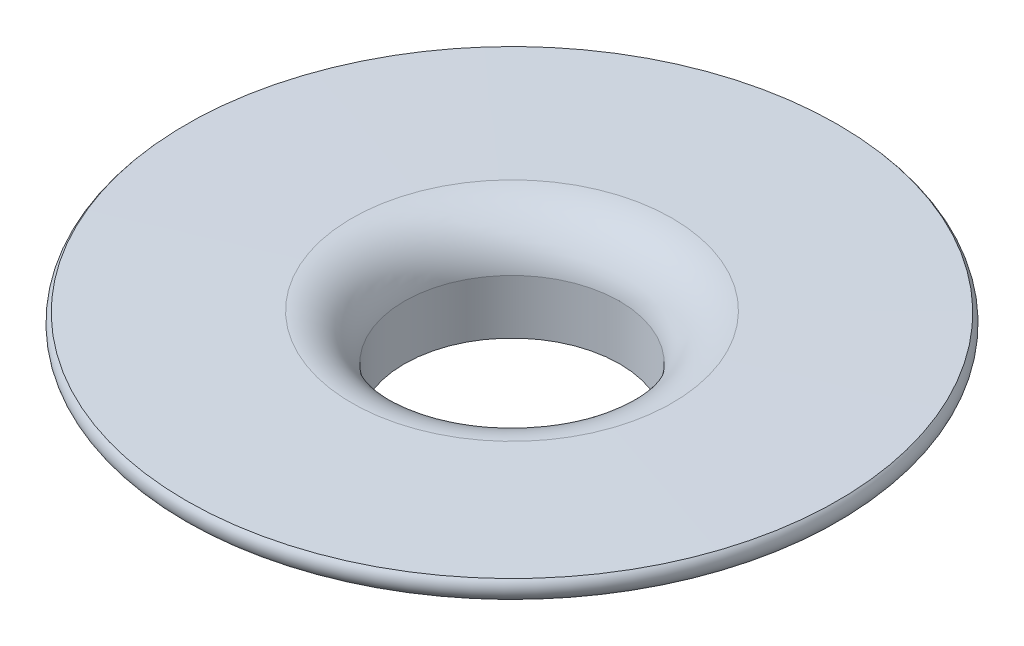
ISO-10303-21;
HEADER;
FILE_DESCRIPTION(('STEP AP214'),'2;1');
FILE_NAME('part.step','',(''),(''),'','','');
FILE_SCHEMA(('AUTOMOTIVE_DESIGN { 1 0 10303 214 1 1 1 1 }'));
ENDSEC;
DATA;
#1=APPLICATION_CONTEXT('core data for automotive mechanical design processes');
#2=APPLICATION_PROTOCOL_DEFINITION('international standard','automotive_design',2000,#1);
#3=PRODUCT_CONTEXT('',#1,'mechanical');
#4=PRODUCT('Part','Part','',(#3));
#5=PRODUCT_RELATED_PRODUCT_CATEGORY('part','',(#4));
#6=PRODUCT_DEFINITION_FORMATION('','',#4);
#7=PRODUCT_DEFINITION_CONTEXT('part definition',#1,'design');
#8=PRODUCT_DEFINITION('design','',#6,#7);
#9=PRODUCT_DEFINITION_SHAPE('','',#8);
#10=(LENGTH_UNIT() NAMED_UNIT(*) SI_UNIT(.MILLI.,.METRE.));
#11=(NAMED_UNIT(*) PLANE_ANGLE_UNIT() SI_UNIT($,.RADIAN.));
#12=(NAMED_UNIT(*) SI_UNIT($,.STERADIAN.) SOLID_ANGLE_UNIT());
#13=UNCERTAINTY_MEASURE_WITH_UNIT(LENGTH_MEASURE(1.E-05),#10,'distance_accuracy_value','');
#14=(GEOMETRIC_REPRESENTATION_CONTEXT(3) GLOBAL_UNCERTAINTY_ASSIGNED_CONTEXT((#13)) GLOBAL_UNIT_ASSIGNED_CONTEXT((#10,
#11,#12)) REPRESENTATION_CONTEXT('',''));
#15=CARTESIAN_POINT('',(0.,0.,0.));
#16=DIRECTION('',(0.,0.,1.));
#17=DIRECTION('',(1.,0.,0.));
#18=AXIS2_PLACEMENT_3D('',#15,#16,#17);
#19=CARTESIAN_POINT('',(0.,-0.750000000001275,0.));
#20=DIRECTION('',(0.,-1.,0.));
#21=DIRECTION('',(0.,0.,-1.));
#22=AXIS2_PLACEMENT_3D('',#19,#20,#21);
#23=TOROIDAL_SURFACE('',#22,17.4999999999979,0.707106781188434);
#24=CARTESIAN_POINT('',(0.,-1.25000000000261,0.));
#25=DIRECTION('',(0.,-1.,0.));
#26=DIRECTION('',(0.,0.,-1.));
#27=AXIS2_PLACEMENT_3D('',#24,#25,#26);
#28=CIRCLE('',#27,17.9999999999993);
#29=CARTESIAN_POINT('',(0.,-1.25000000000255,-17.9999999999993));
#30=VERTEX_POINT('',#29);
#31=EDGE_CURVE('E79',#30,#30,#28,.T.);
#32=ORIENTED_EDGE('',*,*,#31,.F.);
#33=EDGE_LOOP('',(#32));
#34=FACE_BOUND('',#33,.T.);
#35=CARTESIAN_POINT('',(0.,-0.249999999999945,0.));
#36=DIRECTION('',(0.,-1.,0.));
#37=DIRECTION('',(0.,0.,-1.));
#38=AXIS2_PLACEMENT_3D('',#35,#36,#37);
#39=CIRCLE('',#38,17.9999999999993);
#40=CARTESIAN_POINT('',(0.,-0.249999999999883,-17.9999999999993));
#41=VERTEX_POINT('',#40);
#42=EDGE_CURVE('E10',#41,#41,#39,.T.);
#43=ORIENTED_EDGE('',*,*,#42,.T.);
#44=EDGE_LOOP('',(#43));
#45=FACE_BOUND('',#44,.T.);
#46=ADVANCED_FACE('F41',(#34,#45),#23,.T.);
#47=CARTESIAN_POINT('',(0.,-0.157230615364296,0.));
#48=DIRECTION('',(0.,-1.,0.));
#49=DIRECTION('',(0.,0.,-1.));
#50=AXIS2_PLACEMENT_3D('',#47,#48,#49);
#51=CONICAL_SURFACE('',#50,8.84738237891637,1.5606608429604);
#52=ORIENTED_EDGE('',*,*,#42,.F.);
#53=EDGE_LOOP('',(#52));
#54=FACE_BOUND('',#53,.T.);
#55=CARTESIAN_POINT('',(0.,-0.157230615364296,0.));
#56=DIRECTION('',(0.,-1.,0.));
#57=DIRECTION('',(0.,0.,-1.));
#58=AXIS2_PLACEMENT_3D('',#55,#56,#57);
#59=CIRCLE('',#58,8.84738237891637);
#60=CARTESIAN_POINT('',(0.,-0.157230615364265,-8.84738237891637));
#61=VERTEX_POINT('',#60);
#62=EDGE_CURVE('E48',#61,#61,#59,.T.);
#63=ORIENTED_EDGE('',*,*,#62,.T.);
#64=EDGE_LOOP('',(#63));
#65=FACE_BOUND('',#64,.T.);
#66=ADVANCED_FACE('F87',(#54,#65),#51,.T.);
#67=CARTESIAN_POINT('',(0.,-3.15655298367524,0.));
#68=DIRECTION('',(0.,-1.,0.));
#69=DIRECTION('',(0.,0.,-1.));
#70=AXIS2_PLACEMENT_3D('',#67,#68,#69);
#71=TOROIDAL_SURFACE('',#70,8.91114232676444,3.);
#72=ORIENTED_EDGE('',*,*,#62,.F.);
#73=EDGE_LOOP('',(#72));
#74=FACE_BOUND('',#73,.T.);
#75=CARTESIAN_POINT('',(0.,-2.67948711480986,0.));
#76=DIRECTION('',(0.,-1.,0.));
#77=DIRECTION('',(0.,0.,-1.));
#78=AXIS2_PLACEMENT_3D('',#75,#76,#77);
#79=CIRCLE('',#78,5.94931718729997);
#80=CARTESIAN_POINT('',(0.,-2.67948711480984,-5.94931718729998));
#81=VERTEX_POINT('',#80);
#82=EDGE_CURVE('E55',#81,#81,#79,.T.);
#83=ORIENTED_EDGE('',*,*,#82,.T.);
#84=EDGE_LOOP('',(#83));
#85=FACE_BOUND('',#84,.T.);
#86=ADVANCED_FACE('F91',(#74,#85),#71,.T.);
#87=CARTESIAN_POINT('',(0.,-237.677688504326,-8.15293653049448E-13));
#88=DIRECTION('',(0.,-1.,0.));
#89=DIRECTION('',(0.,0.,-1.));
#90=AXIS2_PLACEMENT_3D('',#87,#88,#89);
#91=CYLINDRICAL_SURFACE('',#90,5.94931718729997);
#92=ORIENTED_EDGE('',*,*,#82,.F.);
#93=EDGE_LOOP('',(#92));
#94=FACE_BOUND('',#93,.T.);
#95=CARTESIAN_POINT('',(0.,-5.67948711480987,0.));
#96=DIRECTION('',(0.,-1.,0.));
#97=DIRECTION('',(0.,0.,-1.));
#98=AXIS2_PLACEMENT_3D('',#95,#96,#97);
#99=CIRCLE('',#98,5.94931718729998);
#100=CARTESIAN_POINT('',(0.,-5.67948711480985,-5.9493171873));
#101=VERTEX_POINT('',#100);
#102=EDGE_CURVE('E62',#101,#101,#99,.T.);
#103=ORIENTED_EDGE('',*,*,#102,.T.);
#104=EDGE_LOOP('',(#103));
#105=FACE_BOUND('',#104,.T.);
#106=ADVANCED_FACE('F96',(#94,#105),#91,.F.);
#107=CARTESIAN_POINT('',(0.,-5.67948711480988,6.94842599003274));
#108=DIRECTION('',(0.,1.,0.));
#109=DIRECTION('',(0.,0.,1.));
#110=AXIS2_PLACEMENT_3D('',#107,#108,#109);
#111=PLANE('',#110);
#112=ORIENTED_EDGE('',*,*,#102,.F.);
#113=EDGE_LOOP('',(#112));
#114=FACE_BOUND('',#113,.T.);
#115=CARTESIAN_POINT('',(0.,-5.67948711480987,0.));
#116=DIRECTION('',(0.,-1.,0.));
#117=DIRECTION('',(0.,0.,-1.));
#118=AXIS2_PLACEMENT_3D('',#115,#116,#117);
#119=CIRCLE('',#118,6.94842599003276);
#120=CARTESIAN_POINT('',(0.,-5.67948711480984,-6.94842599003278));
#121=VERTEX_POINT('',#120);
#122=EDGE_CURVE('E68',#121,#121,#119,.T.);
#123=ORIENTED_EDGE('',*,*,#122,.T.);
#124=EDGE_LOOP('',(#123));
#125=FACE_BOUND('',#124,.T.);
#126=ADVANCED_FACE('F102',(#114,#125),#111,.F.);
#127=CARTESIAN_POINT('',(0.,-237.677688504326,-8.15293653049448E-13));
#128=DIRECTION('',(0.,-1.,0.));
#129=DIRECTION('',(0.,0.,-1.));
#130=AXIS2_PLACEMENT_3D('',#127,#128,#129);
#131=CYLINDRICAL_SURFACE('',#130,6.94842599003275);
#132=ORIENTED_EDGE('',*,*,#122,.F.);
#133=EDGE_LOOP('',(#132));
#134=FACE_BOUND('',#133,.T.);
#135=CARTESIAN_POINT('',(0.,-2.67948711480986,0.));
#136=DIRECTION('',(0.,-1.,0.));
#137=DIRECTION('',(0.,0.,-1.));
#138=AXIS2_PLACEMENT_3D('',#135,#136,#137);
#139=CIRCLE('',#138,6.94842599003274);
#140=CARTESIAN_POINT('',(0.,-2.67948711480984,-6.94842599003275));
#141=VERTEX_POINT('',#140);
#142=EDGE_CURVE('E71',#141,#141,#139,.T.);
#143=ORIENTED_EDGE('',*,*,#142,.T.);
#144=EDGE_LOOP('',(#143));
#145=FACE_BOUND('',#144,.T.);
#146=ADVANCED_FACE('F106',(#134,#145),#131,.T.);
#147=CARTESIAN_POINT('',(0.,-3.10000000000264,0.));
#148=DIRECTION('',(0.,-1.,0.));
#149=DIRECTION('',(0.,0.,-1.));
#150=AXIS2_PLACEMENT_3D('',#147,#148,#149);
#151=TOROIDAL_SURFACE('',#150,8.74999999999926,1.85);
#152=ORIENTED_EDGE('',*,*,#142,.F.);
#153=EDGE_LOOP('',(#152));
#154=FACE_BOUND('',#153,.T.);
#155=CARTESIAN_POINT('',(0.,-1.25000000000264,0.));
#156=DIRECTION('',(0.,-1.,0.));
#157=DIRECTION('',(0.,0.,-1.));
#158=AXIS2_PLACEMENT_3D('',#155,#156,#157);
#159=CIRCLE('',#158,8.74999999999926);
#160=CARTESIAN_POINT('',(0.,-1.25000000000261,-8.74999999999926));
#161=VERTEX_POINT('',#160);
#162=EDGE_CURVE('E75',#161,#161,#159,.T.);
#163=ORIENTED_EDGE('',*,*,#162,.T.);
#164=EDGE_LOOP('',(#163));
#165=FACE_BOUND('',#164,.T.);
#166=ADVANCED_FACE('F110',(#154,#165),#151,.F.);
#167=CARTESIAN_POINT('',(0.,-1.25000000000268,17.9999999999993));
#168=DIRECTION('',(0.,1.,0.));
#169=DIRECTION('',(0.,0.,1.));
#170=AXIS2_PLACEMENT_3D('',#167,#168,#169);
#171=PLANE('',#170);
#172=ORIENTED_EDGE('',*,*,#162,.F.);
#173=EDGE_LOOP('',(#172));
#174=FACE_BOUND('',#173,.T.);
#175=ORIENTED_EDGE('',*,*,#31,.T.);
#176=EDGE_LOOP('',(#175));
#177=FACE_BOUND('',#176,.T.);
#178=ADVANCED_FACE('F84',(#174,#177),#171,.F.);
#179=CLOSED_SHELL('',(#46,#66,#86,#106,#126,#146,#166,#178));
#180=MANIFOLD_SOLID_BREP('B2',#179);
#181=ADVANCED_BREP_SHAPE_REPRESENTATION('',(#18,#180),#14);
#182=SHAPE_DEFINITION_REPRESENTATION(#9,#181);
ENDSEC;
END-ISO-10303-21;
